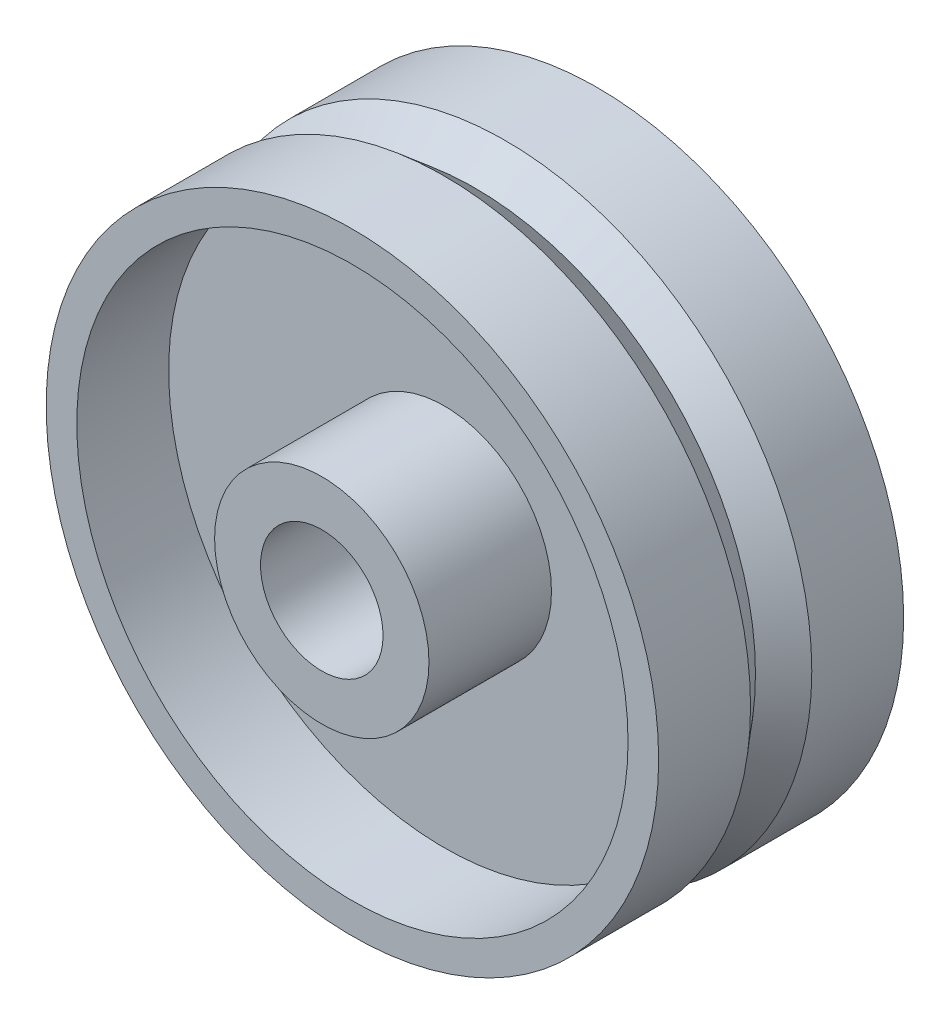
ISO-10303-21;
HEADER;
FILE_DESCRIPTION(('STEP AP214'),'2;1');
FILE_NAME('part.step','',(''),(''),'','','');
FILE_SCHEMA(('AUTOMOTIVE_DESIGN { 1 0 10303 214 1 1 1 1 }'));
ENDSEC;
DATA;
#1=APPLICATION_CONTEXT('core data for automotive mechanical design processes');
#2=APPLICATION_PROTOCOL_DEFINITION('international standard','automotive_design',2000,#1);
#3=PRODUCT_CONTEXT('',#1,'mechanical');
#4=PRODUCT('Part','Part','',(#3));
#5=PRODUCT_RELATED_PRODUCT_CATEGORY('part','',(#4));
#6=PRODUCT_DEFINITION_FORMATION('','',#4);
#7=PRODUCT_DEFINITION_CONTEXT('part definition',#1,'design');
#8=PRODUCT_DEFINITION('design','',#6,#7);
#9=PRODUCT_DEFINITION_SHAPE('','',#8);
#10=(LENGTH_UNIT() NAMED_UNIT(*) SI_UNIT(.MILLI.,.METRE.));
#11=(NAMED_UNIT(*) PLANE_ANGLE_UNIT() SI_UNIT($,.RADIAN.));
#12=(NAMED_UNIT(*) SI_UNIT($,.STERADIAN.) SOLID_ANGLE_UNIT());
#13=UNCERTAINTY_MEASURE_WITH_UNIT(LENGTH_MEASURE(1.E-05),#10,'distance_accuracy_value','');
#14=(GEOMETRIC_REPRESENTATION_CONTEXT(3) GLOBAL_UNCERTAINTY_ASSIGNED_CONTEXT((#13)) GLOBAL_UNIT_ASSIGNED_CONTEXT((#10,
#11,#12)) REPRESENTATION_CONTEXT('',''));
#15=CARTESIAN_POINT('',(0.,0.,0.));
#16=DIRECTION('',(0.,0.,1.));
#17=DIRECTION('',(1.,0.,0.));
#18=AXIS2_PLACEMENT_3D('',#15,#16,#17);
#19=CARTESIAN_POINT('',(0.,0.,0.));
#20=DIRECTION('',(0.,0.,1.));
#21=DIRECTION('',(1.,0.,0.));
#22=AXIS2_PLACEMENT_3D('',#19,#20,#21);
#23=CONICAL_SURFACE('',#22,45.8045018441136,0.698131700797733);
#24=CARTESIAN_POINT('',(0.,0.,5.));
#25=DIRECTION('',(0.,0.,1.));
#26=DIRECTION('',(1.,0.,0.));
#27=AXIS2_PLACEMENT_3D('',#24,#25,#26);
#28=CIRCLE('',#27,50.);
#29=CARTESIAN_POINT('',(50.,0.,5.));
#30=VERTEX_POINT('',#29);
#31=EDGE_CURVE('E10',#30,#30,#28,.T.);
#32=ORIENTED_EDGE('',*,*,#31,.F.);
#33=EDGE_LOOP('',(#32));
#34=FACE_BOUND('',#33,.T.);
#35=CARTESIAN_POINT('',(0.,0.,0.));
#36=DIRECTION('',(0.,0.,1.));
#37=DIRECTION('',(1.,0.,0.));
#38=AXIS2_PLACEMENT_3D('',#35,#36,#37);
#39=CIRCLE('',#38,45.8045018441136);
#40=CARTESIAN_POINT('',(45.8045018441136,0.,0.));
#41=VERTEX_POINT('',#40);
#42=EDGE_CURVE('E86',#41,#41,#39,.T.);
#43=ORIENTED_EDGE('',*,*,#42,.T.);
#44=EDGE_LOOP('',(#43));
#45=FACE_BOUND('',#44,.T.);
#46=ADVANCED_FACE('F37',(#34,#45),#23,.T.);
#47=CARTESIAN_POINT('',(0.,0.,0.));
#48=DIRECTION('',(0.,0.,1.));
#49=DIRECTION('',(1.,0.,0.));
#50=AXIS2_PLACEMENT_3D('',#47,#48,#49);
#51=CYLINDRICAL_SURFACE('',#50,50.);
#52=CARTESIAN_POINT('',(0.,0.,20.));
#53=DIRECTION('',(0.,0.,1.));
#54=DIRECTION('',(1.,0.,0.));
#55=AXIS2_PLACEMENT_3D('',#52,#53,#54);
#56=CIRCLE('',#55,50.);
#57=CARTESIAN_POINT('',(50.,0.,20.));
#58=VERTEX_POINT('',#57);
#59=EDGE_CURVE('E43',#58,#58,#56,.T.);
#60=ORIENTED_EDGE('',*,*,#59,.F.);
#61=EDGE_LOOP('',(#60));
#62=FACE_BOUND('',#61,.T.);
#63=ORIENTED_EDGE('',*,*,#31,.T.);
#64=EDGE_LOOP('',(#63));
#65=FACE_BOUND('',#64,.T.);
#66=ADVANCED_FACE('F165',(#62,#65),#51,.T.);
#67=CARTESIAN_POINT('',(0.,45.,20.));
#68=DIRECTION('',(0.,0.,-1.));
#69=DIRECTION('',(-1.,0.,0.));
#70=AXIS2_PLACEMENT_3D('',#67,#68,#69);
#71=PLANE('',#70);
#72=CARTESIAN_POINT('',(0.,0.,20.));
#73=DIRECTION('',(0.,0.,1.));
#74=DIRECTION('',(1.,0.,0.));
#75=AXIS2_PLACEMENT_3D('',#72,#73,#74);
#76=CIRCLE('',#75,45.);
#77=CARTESIAN_POINT('',(45.,0.,20.));
#78=VERTEX_POINT('',#77);
#79=EDGE_CURVE('E47',#78,#78,#76,.T.);
#80=ORIENTED_EDGE('',*,*,#79,.F.);
#81=EDGE_LOOP('',(#80));
#82=FACE_BOUND('',#81,.T.);
#83=ORIENTED_EDGE('',*,*,#59,.T.);
#84=EDGE_LOOP('',(#83));
#85=FACE_BOUND('',#84,.T.);
#86=ADVANCED_FACE('F160',(#82,#85),#71,.F.);
#87=CARTESIAN_POINT('',(0.,0.,0.));
#88=DIRECTION('',(0.,0.,1.));
#89=DIRECTION('',(1.,0.,0.));
#90=AXIS2_PLACEMENT_3D('',#87,#88,#89);
#91=CYLINDRICAL_SURFACE('',#90,45.);
#92=CARTESIAN_POINT('',(0.,0.,5.));
#93=DIRECTION('',(0.,0.,1.));
#94=DIRECTION('',(1.,0.,0.));
#95=AXIS2_PLACEMENT_3D('',#92,#93,#94);
#96=CIRCLE('',#95,45.);
#97=CARTESIAN_POINT('',(45.,0.,5.));
#98=VERTEX_POINT('',#97);
#99=EDGE_CURVE('E51',#98,#98,#96,.T.);
#100=ORIENTED_EDGE('',*,*,#99,.F.);
#101=EDGE_LOOP('',(#100));
#102=FACE_BOUND('',#101,.T.);
#103=ORIENTED_EDGE('',*,*,#79,.T.);
#104=EDGE_LOOP('',(#103));
#105=FACE_BOUND('',#104,.T.);
#106=ADVANCED_FACE('F154',(#102,#105),#91,.F.);
#107=CARTESIAN_POINT('',(0.,17.5,5.));
#108=DIRECTION('',(0.,0.,-1.));
#109=DIRECTION('',(-1.,0.,0.));
#110=AXIS2_PLACEMENT_3D('',#107,#108,#109);
#111=PLANE('',#110);
#112=CARTESIAN_POINT('',(0.,0.,4.99999999999999));
#113=DIRECTION('',(0.,0.,1.));
#114=DIRECTION('',(1.,0.,0.));
#115=AXIS2_PLACEMENT_3D('',#112,#113,#114);
#116=CIRCLE('',#115,17.5);
#117=CARTESIAN_POINT('',(17.5,0.,4.99999999999999));
#118=VERTEX_POINT('',#117);
#119=EDGE_CURVE('E56',#118,#118,#116,.T.);
#120=ORIENTED_EDGE('',*,*,#119,.F.);
#121=EDGE_LOOP('',(#120));
#122=FACE_BOUND('',#121,.T.);
#123=ORIENTED_EDGE('',*,*,#99,.T.);
#124=EDGE_LOOP('',(#123));
#125=FACE_BOUND('',#124,.T.);
#126=ADVANCED_FACE('F148',(#122,#125),#111,.F.);
#127=CARTESIAN_POINT('',(0.,0.,0.));
#128=DIRECTION('',(0.,0.,1.));
#129=DIRECTION('',(1.,0.,0.));
#130=AXIS2_PLACEMENT_3D('',#127,#128,#129);
#131=CYLINDRICAL_SURFACE('',#130,17.5);
#132=CARTESIAN_POINT('',(0.,0.,25.));
#133=DIRECTION('',(0.,0.,1.));
#134=DIRECTION('',(1.,0.,0.));
#135=AXIS2_PLACEMENT_3D('',#132,#133,#134);
#136=CIRCLE('',#135,17.5);
#137=CARTESIAN_POINT('',(17.5,0.,25.));
#138=VERTEX_POINT('',#137);
#139=EDGE_CURVE('E59',#138,#138,#136,.T.);
#140=ORIENTED_EDGE('',*,*,#139,.F.);
#141=EDGE_LOOP('',(#140));
#142=FACE_BOUND('',#141,.T.);
#143=ORIENTED_EDGE('',*,*,#119,.T.);
#144=EDGE_LOOP('',(#143));
#145=FACE_BOUND('',#144,.T.);
#146=ADVANCED_FACE('F142',(#142,#145),#131,.T.);
#147=CARTESIAN_POINT('',(0.,9.99999999999999,25.));
#148=DIRECTION('',(0.,0.,-1.));
#149=DIRECTION('',(-1.,0.,0.));
#150=AXIS2_PLACEMENT_3D('',#147,#148,#149);
#151=PLANE('',#150);
#152=CARTESIAN_POINT('',(0.,0.,25.));
#153=DIRECTION('',(0.,0.,1.));
#154=DIRECTION('',(1.,0.,0.));
#155=AXIS2_PLACEMENT_3D('',#152,#153,#154);
#156=CIRCLE('',#155,9.99999999999999);
#157=CARTESIAN_POINT('',(9.99999999999999,0.,25.));
#158=VERTEX_POINT('',#157);
#159=EDGE_CURVE('E62',#158,#158,#156,.T.);
#160=ORIENTED_EDGE('',*,*,#159,.F.);
#161=EDGE_LOOP('',(#160));
#162=FACE_BOUND('',#161,.T.);
#163=ORIENTED_EDGE('',*,*,#139,.T.);
#164=EDGE_LOOP('',(#163));
#165=FACE_BOUND('',#164,.T.);
#166=ADVANCED_FACE('F136',(#162,#165),#151,.F.);
#167=CARTESIAN_POINT('',(0.,0.,0.));
#168=DIRECTION('',(0.,0.,1.));
#169=DIRECTION('',(1.,0.,0.));
#170=AXIS2_PLACEMENT_3D('',#167,#168,#169);
#171=CYLINDRICAL_SURFACE('',#170,9.99999999999999);
#172=CARTESIAN_POINT('',(0.,0.,-25.));
#173=DIRECTION('',(0.,0.,1.));
#174=DIRECTION('',(1.,0.,0.));
#175=AXIS2_PLACEMENT_3D('',#172,#173,#174);
#176=CIRCLE('',#175,9.99999999999999);
#177=CARTESIAN_POINT('',(9.99999999999999,0.,-25.));
#178=VERTEX_POINT('',#177);
#179=EDGE_CURVE('E65',#178,#178,#176,.T.);
#180=ORIENTED_EDGE('',*,*,#179,.F.);
#181=EDGE_LOOP('',(#180));
#182=FACE_BOUND('',#181,.T.);
#183=ORIENTED_EDGE('',*,*,#159,.T.);
#184=EDGE_LOOP('',(#183));
#185=FACE_BOUND('',#184,.T.);
#186=ADVANCED_FACE('F130',(#182,#185),#171,.F.);
#187=CARTESIAN_POINT('',(0.,17.5,-25.));
#188=DIRECTION('',(0.,0.,1.));
#189=DIRECTION('',(1.,0.,0.));
#190=AXIS2_PLACEMENT_3D('',#187,#188,#189);
#191=PLANE('',#190);
#192=CARTESIAN_POINT('',(0.,0.,-25.));
#193=DIRECTION('',(0.,0.,1.));
#194=DIRECTION('',(1.,0.,0.));
#195=AXIS2_PLACEMENT_3D('',#192,#193,#194);
#196=CIRCLE('',#195,17.5);
#197=CARTESIAN_POINT('',(17.5,0.,-25.));
#198=VERTEX_POINT('',#197);
#199=EDGE_CURVE('E68',#198,#198,#196,.T.);
#200=ORIENTED_EDGE('',*,*,#199,.F.);
#201=EDGE_LOOP('',(#200));
#202=FACE_BOUND('',#201,.T.);
#203=ORIENTED_EDGE('',*,*,#179,.T.);
#204=EDGE_LOOP('',(#203));
#205=FACE_BOUND('',#204,.T.);
#206=ADVANCED_FACE('F124',(#202,#205),#191,.F.);
#207=CARTESIAN_POINT('',(0.,0.,0.));
#208=DIRECTION('',(0.,0.,1.));
#209=DIRECTION('',(1.,0.,0.));
#210=AXIS2_PLACEMENT_3D('',#207,#208,#209);
#211=CYLINDRICAL_SURFACE('',#210,17.5);
#212=CARTESIAN_POINT('',(0.,0.,-5.00000000000001));
#213=DIRECTION('',(0.,0.,1.));
#214=DIRECTION('',(1.,0.,0.));
#215=AXIS2_PLACEMENT_3D('',#212,#213,#214);
#216=CIRCLE('',#215,17.5);
#217=CARTESIAN_POINT('',(17.5,0.,-5.00000000000001));
#218=VERTEX_POINT('',#217);
#219=EDGE_CURVE('E71',#218,#218,#216,.T.);
#220=ORIENTED_EDGE('',*,*,#219,.F.);
#221=EDGE_LOOP('',(#220));
#222=FACE_BOUND('',#221,.T.);
#223=ORIENTED_EDGE('',*,*,#199,.T.);
#224=EDGE_LOOP('',(#223));
#225=FACE_BOUND('',#224,.T.);
#226=ADVANCED_FACE('F118',(#222,#225),#211,.T.);
#227=CARTESIAN_POINT('',(0.,45.,-5.00000000000001));
#228=DIRECTION('',(0.,0.,1.));
#229=DIRECTION('',(1.,0.,0.));
#230=AXIS2_PLACEMENT_3D('',#227,#228,#229);
#231=PLANE('',#230);
#232=CARTESIAN_POINT('',(0.,0.,-5.));
#233=DIRECTION('',(0.,0.,1.));
#234=DIRECTION('',(1.,0.,0.));
#235=AXIS2_PLACEMENT_3D('',#232,#233,#234);
#236=CIRCLE('',#235,45.);
#237=CARTESIAN_POINT('',(45.,0.,-5.));
#238=VERTEX_POINT('',#237);
#239=EDGE_CURVE('E74',#238,#238,#236,.T.);
#240=ORIENTED_EDGE('',*,*,#239,.F.);
#241=EDGE_LOOP('',(#240));
#242=FACE_BOUND('',#241,.T.);
#243=ORIENTED_EDGE('',*,*,#219,.T.);
#244=EDGE_LOOP('',(#243));
#245=FACE_BOUND('',#244,.T.);
#246=ADVANCED_FACE('F112',(#242,#245),#231,.F.);
#247=CARTESIAN_POINT('',(0.,0.,0.));
#248=DIRECTION('',(0.,0.,1.));
#249=DIRECTION('',(1.,0.,0.));
#250=AXIS2_PLACEMENT_3D('',#247,#248,#249);
#251=CYLINDRICAL_SURFACE('',#250,45.);
#252=CARTESIAN_POINT('',(0.,0.,-20.));
#253=DIRECTION('',(0.,0.,1.));
#254=DIRECTION('',(1.,0.,0.));
#255=AXIS2_PLACEMENT_3D('',#252,#253,#254);
#256=CIRCLE('',#255,45.);
#257=CARTESIAN_POINT('',(45.,0.,-20.));
#258=VERTEX_POINT('',#257);
#259=EDGE_CURVE('E77',#258,#258,#256,.T.);
#260=ORIENTED_EDGE('',*,*,#259,.F.);
#261=EDGE_LOOP('',(#260));
#262=FACE_BOUND('',#261,.T.);
#263=ORIENTED_EDGE('',*,*,#239,.T.);
#264=EDGE_LOOP('',(#263));
#265=FACE_BOUND('',#264,.T.);
#266=ADVANCED_FACE('F106',(#262,#265),#251,.F.);
#267=CARTESIAN_POINT('',(0.,50.,-20.));
#268=DIRECTION('',(0.,0.,1.));
#269=DIRECTION('',(1.,0.,0.));
#270=AXIS2_PLACEMENT_3D('',#267,#268,#269);
#271=PLANE('',#270);
#272=CARTESIAN_POINT('',(0.,0.,-20.));
#273=DIRECTION('',(0.,0.,1.));
#274=DIRECTION('',(1.,0.,0.));
#275=AXIS2_PLACEMENT_3D('',#272,#273,#274);
#276=CIRCLE('',#275,50.);
#277=CARTESIAN_POINT('',(50.,0.,-20.));
#278=VERTEX_POINT('',#277);
#279=EDGE_CURVE('E80',#278,#278,#276,.T.);
#280=ORIENTED_EDGE('',*,*,#279,.F.);
#281=EDGE_LOOP('',(#280));
#282=FACE_BOUND('',#281,.T.);
#283=ORIENTED_EDGE('',*,*,#259,.T.);
#284=EDGE_LOOP('',(#283));
#285=FACE_BOUND('',#284,.T.);
#286=ADVANCED_FACE('F100',(#282,#285),#271,.F.);
#287=CARTESIAN_POINT('',(0.,0.,0.));
#288=DIRECTION('',(0.,0.,1.));
#289=DIRECTION('',(1.,0.,0.));
#290=AXIS2_PLACEMENT_3D('',#287,#288,#289);
#291=CYLINDRICAL_SURFACE('',#290,50.);
#292=CARTESIAN_POINT('',(0.,0.,-5.));
#293=DIRECTION('',(0.,0.,1.));
#294=DIRECTION('',(1.,0.,0.));
#295=AXIS2_PLACEMENT_3D('',#292,#293,#294);
#296=CIRCLE('',#295,50.);
#297=CARTESIAN_POINT('',(50.,0.,-5.));
#298=VERTEX_POINT('',#297);
#299=EDGE_CURVE('E83',#298,#298,#296,.T.);
#300=ORIENTED_EDGE('',*,*,#299,.F.);
#301=EDGE_LOOP('',(#300));
#302=FACE_BOUND('',#301,.T.);
#303=ORIENTED_EDGE('',*,*,#279,.T.);
#304=EDGE_LOOP('',(#303));
#305=FACE_BOUND('',#304,.T.);
#306=ADVANCED_FACE('F94',(#302,#305),#291,.T.);
#307=CARTESIAN_POINT('',(0.,0.,-5.));
#308=DIRECTION('',(0.,0.,-1.));
#309=DIRECTION('',(-1.,0.,0.));
#310=AXIS2_PLACEMENT_3D('',#307,#308,#309);
#311=CONICAL_SURFACE('',#310,50.,0.698131700797734);
#312=ORIENTED_EDGE('',*,*,#42,.F.);
#313=EDGE_LOOP('',(#312));
#314=FACE_BOUND('',#313,.T.);
#315=ORIENTED_EDGE('',*,*,#299,.T.);
#316=EDGE_LOOP('',(#315));
#317=FACE_BOUND('',#316,.T.);
#318=ADVANCED_FACE('F91',(#314,#317),#311,.T.);
#319=CLOSED_SHELL('',(#46,#66,#86,#106,#126,#146,#166,#186,#206,#226,#246,#266,#286,#306,#318));
#320=MANIFOLD_SOLID_BREP('B2',#319);
#321=ADVANCED_BREP_SHAPE_REPRESENTATION('',(#18,#320),#14);
#322=SHAPE_DEFINITION_REPRESENTATION(#9,#321);
ENDSEC;
END-ISO-10303-21;
